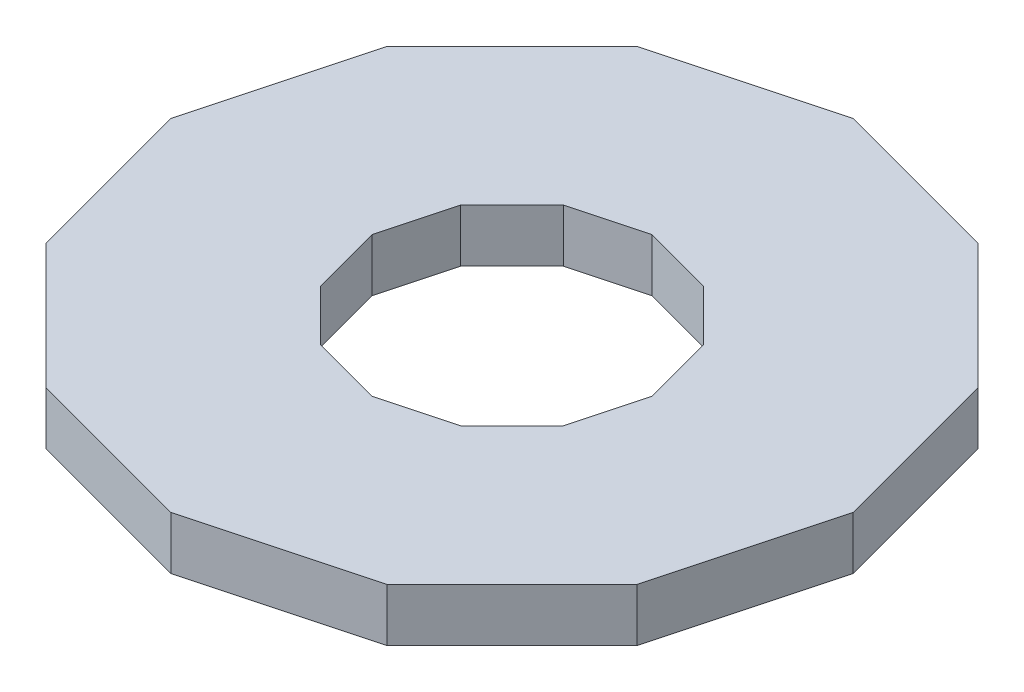
ISO-10303-21;
HEADER;
FILE_DESCRIPTION(('STEP AP214'),'2;1');
FILE_NAME('part.step','',(''),(''),'','','');
FILE_SCHEMA(('AUTOMOTIVE_DESIGN { 1 0 10303 214 1 1 1 1 }'));
ENDSEC;
DATA;
#1=APPLICATION_CONTEXT('core data for automotive mechanical design processes');
#2=APPLICATION_PROTOCOL_DEFINITION('international standard','automotive_design',2000,#1);
#3=PRODUCT_CONTEXT('',#1,'mechanical');
#4=PRODUCT('Part','Part','',(#3));
#5=PRODUCT_RELATED_PRODUCT_CATEGORY('part','',(#4));
#6=PRODUCT_DEFINITION_FORMATION('','',#4);
#7=PRODUCT_DEFINITION_CONTEXT('part definition',#1,'design');
#8=PRODUCT_DEFINITION('design','',#6,#7);
#9=PRODUCT_DEFINITION_SHAPE('','',#8);
#10=(LENGTH_UNIT() NAMED_UNIT(*) SI_UNIT(.MILLI.,.METRE.));
#11=(NAMED_UNIT(*) PLANE_ANGLE_UNIT() SI_UNIT($,.RADIAN.));
#12=(NAMED_UNIT(*) SI_UNIT($,.STERADIAN.) SOLID_ANGLE_UNIT());
#13=UNCERTAINTY_MEASURE_WITH_UNIT(LENGTH_MEASURE(1.E-05),#10,'distance_accuracy_value','');
#14=(GEOMETRIC_REPRESENTATION_CONTEXT(3) GLOBAL_UNCERTAINTY_ASSIGNED_CONTEXT((#13)) GLOBAL_UNIT_ASSIGNED_CONTEXT((#10,
#11,#12)) REPRESENTATION_CONTEXT('',''));
#15=CARTESIAN_POINT('',(0.,0.,0.));
#16=DIRECTION('',(0.,0.,1.));
#17=DIRECTION('',(1.,0.,0.));
#18=AXIS2_PLACEMENT_3D('',#15,#16,#17);
#19=CARTESIAN_POINT('',(0.,19.05,0.));
#20=DIRECTION('',(0.,1.,0.));
#21=DIRECTION('',(0.,0.,1.));
#22=AXIS2_PLACEMENT_3D('',#19,#20,#21);
#23=PLANE('',#22);
#24=DIRECTION('',(-0.258819045102521,0.,0.965925826289068));
#25=VECTOR('',#24,1.);
#26=CARTESIAN_POINT('',(-106.237570574702,19.05,-61.3362899693558));
#27=LINE('',#26,#25);
#28=CARTESIAN_POINT('',(-106.237570574702,19.05,-61.3362899693558));
#29=VERTEX_POINT('',#28);
#30=CARTESIAN_POINT('',(-122.672579938712,19.05,0.));
#31=VERTEX_POINT('',#30);
#32=EDGE_CURVE('E291',#29,#31,#27,.T.);
#33=ORIENTED_EDGE('',*,*,#32,.T.);
#34=DIRECTION('',(0.258819045102521,0.,0.965925826289068));
#35=VECTOR('',#34,1.);
#36=CARTESIAN_POINT('',(-122.672579938712,19.05,0.));
#37=LINE('',#36,#35);
#38=CARTESIAN_POINT('',(-106.237570574702,19.05,61.3362899693559));
#39=VERTEX_POINT('',#38);
#40=EDGE_CURVE('E294',#31,#39,#37,.T.);
#41=ORIENTED_EDGE('',*,*,#40,.T.);
#42=DIRECTION('',(0.707106781186548,0.,0.707106781186547));
#43=VECTOR('',#42,1.);
#44=CARTESIAN_POINT('',(-106.237570574702,19.05,61.3362899693559));
#45=LINE('',#44,#43);
#46=CARTESIAN_POINT('',(-61.3362899693559,19.05,106.237570574702));
#47=VERTEX_POINT('',#46);
#48=EDGE_CURVE('E298',#39,#47,#45,.T.);
#49=ORIENTED_EDGE('',*,*,#48,.T.);
#50=DIRECTION('',(0.965925826289068,0.,0.25881904510252));
#51=VECTOR('',#50,1.);
#52=CARTESIAN_POINT('',(-61.3362899693559,19.05,106.237570574702));
#53=LINE('',#52,#51);
#54=CARTESIAN_POINT('',(0.,19.05,122.672579938712));
#55=VERTEX_POINT('',#54);
#56=EDGE_CURVE('E300',#47,#55,#53,.T.);
#57=ORIENTED_EDGE('',*,*,#56,.T.);
#58=DIRECTION('',(0.965925826289068,0.,-0.258819045102521));
#59=VECTOR('',#58,1.);
#60=CARTESIAN_POINT('',(0.,19.05,122.672579938712));
#61=LINE('',#60,#59);
#62=CARTESIAN_POINT('',(61.3362899693559,19.05,106.237570574702));
#63=VERTEX_POINT('',#62);
#64=EDGE_CURVE('E302',#55,#63,#61,.T.);
#65=ORIENTED_EDGE('',*,*,#64,.T.);
#66=DIRECTION('',(0.707106781186547,0.,-0.707106781186548));
#67=VECTOR('',#66,1.);
#68=CARTESIAN_POINT('',(61.3362899693559,19.05,106.237570574702));
#69=LINE('',#68,#67);
#70=CARTESIAN_POINT('',(106.237570574702,19.05,61.3362899693559));
#71=VERTEX_POINT('',#70);
#72=EDGE_CURVE('E304',#63,#71,#69,.T.);
#73=ORIENTED_EDGE('',*,*,#72,.T.);
#74=DIRECTION('',(0.258819045102521,0.,-0.965925826289068));
#75=VECTOR('',#74,1.);
#76=CARTESIAN_POINT('',(106.237570574702,19.05,61.3362899693559));
#77=LINE('',#76,#75);
#78=CARTESIAN_POINT('',(122.672579938712,19.05,0.));
#79=VERTEX_POINT('',#78);
#80=EDGE_CURVE('E306',#71,#79,#77,.T.);
#81=ORIENTED_EDGE('',*,*,#80,.T.);
#82=DIRECTION('',(-0.258819045102521,0.,-0.965925826289068));
#83=VECTOR('',#82,1.);
#84=CARTESIAN_POINT('',(122.672579938712,19.05,0.));
#85=LINE('',#84,#83);
#86=CARTESIAN_POINT('',(106.237570574702,19.05,-61.3362899693559));
#87=VERTEX_POINT('',#86);
#88=EDGE_CURVE('E308',#79,#87,#85,.T.);
#89=ORIENTED_EDGE('',*,*,#88,.T.);
#90=DIRECTION('',(-0.707106781186547,0.,-0.707106781186548));
#91=VECTOR('',#90,1.);
#92=CARTESIAN_POINT('',(106.237570574702,19.05,-61.3362899693559));
#93=LINE('',#92,#91);
#94=CARTESIAN_POINT('',(61.3362899693558,19.05,-106.237570574702));
#95=VERTEX_POINT('',#94);
#96=EDGE_CURVE('E310',#87,#95,#93,.T.);
#97=ORIENTED_EDGE('',*,*,#96,.T.);
#98=DIRECTION('',(-0.965925826289068,0.,-0.25881904510252));
#99=VECTOR('',#98,1.);
#100=CARTESIAN_POINT('',(61.3362899693558,19.05,-106.237570574702));
#101=LINE('',#100,#99);
#102=CARTESIAN_POINT('',(0.,19.05,-122.672579938712));
#103=VERTEX_POINT('',#102);
#104=EDGE_CURVE('E312',#95,#103,#101,.T.);
#105=ORIENTED_EDGE('',*,*,#104,.T.);
#106=DIRECTION('',(-0.965925826289068,0.,0.258819045102521));
#107=VECTOR('',#106,1.);
#108=CARTESIAN_POINT('',(0.,19.05,-122.672579938712));
#109=LINE('',#108,#107);
#110=CARTESIAN_POINT('',(-61.3362899693558,19.05,-106.237570574702));
#111=VERTEX_POINT('',#110);
#112=EDGE_CURVE('E314',#103,#111,#109,.T.);
#113=ORIENTED_EDGE('',*,*,#112,.T.);
#114=DIRECTION('',(-0.707106781186548,0.,0.707106781186547));
#115=VECTOR('',#114,1.);
#116=CARTESIAN_POINT('',(-61.3362899693558,19.05,-106.237570574702));
#117=LINE('',#116,#115);
#118=EDGE_CURVE('E317',#111,#29,#117,.T.);
#119=ORIENTED_EDGE('',*,*,#118,.T.);
#120=EDGE_LOOP('',(#33,#41,#49,#57,#65,#73,#81,#89,#97,#105,#113,#119));
#121=FACE_BOUND('',#120,.T.);
#122=DIRECTION('',(0.258819045102521,0.,0.965925826289068));
#123=VECTOR('',#122,1.);
#124=CARTESIAN_POINT('',(-50.3585387370672,19.05,0.));
#125=LINE('',#124,#123);
#126=CARTESIAN_POINT('',(-50.3585387370672,19.05,0.));
#127=VERTEX_POINT('',#126);
#128=CARTESIAN_POINT('',(-43.6117738437629,19.05,25.1792693685336));
#129=VERTEX_POINT('',#128);
#130=EDGE_CURVE('E203',#127,#129,#125,.T.);
#131=ORIENTED_EDGE('',*,*,#130,.F.);
#132=DIRECTION('',(-0.258819045102521,0.,0.965925826289068));
#133=VECTOR('',#132,1.);
#134=CARTESIAN_POINT('',(-43.6117738437629,19.05,-25.1792693685336));
#135=LINE('',#134,#133);
#136=CARTESIAN_POINT('',(-43.6117738437629,19.05,-25.1792693685336));
#137=VERTEX_POINT('',#136);
#138=EDGE_CURVE('E195',#137,#127,#135,.T.);
#139=ORIENTED_EDGE('',*,*,#138,.F.);
#140=DIRECTION('',(-0.707106781186548,0.,0.707106781186547));
#141=VECTOR('',#140,1.);
#142=CARTESIAN_POINT('',(-25.1792693685336,19.05,-43.6117738437629));
#143=LINE('',#142,#141);
#144=CARTESIAN_POINT('',(-25.1792693685336,19.05,-43.6117738437629));
#145=VERTEX_POINT('',#144);
#146=EDGE_CURVE('E236',#145,#137,#143,.T.);
#147=ORIENTED_EDGE('',*,*,#146,.F.);
#148=DIRECTION('',(-0.965925826289068,0.,0.258819045102521));
#149=VECTOR('',#148,1.);
#150=CARTESIAN_POINT('',(0.,19.05,-50.3585387370672));
#151=LINE('',#150,#149);
#152=CARTESIAN_POINT('',(0.,19.05,-50.3585387370672));
#153=VERTEX_POINT('',#152);
#154=EDGE_CURVE('E234',#153,#145,#151,.T.);
#155=ORIENTED_EDGE('',*,*,#154,.F.);
#156=DIRECTION('',(-0.965925826289068,0.,-0.258819045102521));
#157=VECTOR('',#156,1.);
#158=CARTESIAN_POINT('',(25.1792693685336,19.05,-43.6117738437629));
#159=LINE('',#158,#157);
#160=CARTESIAN_POINT('',(25.1792693685336,19.05,-43.6117738437629));
#161=VERTEX_POINT('',#160);
#162=EDGE_CURVE('E232',#161,#153,#159,.T.);
#163=ORIENTED_EDGE('',*,*,#162,.F.);
#164=DIRECTION('',(-0.707106781186547,0.,-0.707106781186548));
#165=VECTOR('',#164,1.);
#166=CARTESIAN_POINT('',(43.6117738437629,19.05,-25.1792693685336));
#167=LINE('',#166,#165);
#168=CARTESIAN_POINT('',(43.6117738437629,19.05,-25.1792693685336));
#169=VERTEX_POINT('',#168);
#170=EDGE_CURVE('E230',#169,#161,#167,.T.);
#171=ORIENTED_EDGE('',*,*,#170,.F.);
#172=DIRECTION('',(-0.25881904510252,0.,-0.965925826289068));
#173=VECTOR('',#172,1.);
#174=CARTESIAN_POINT('',(50.3585387370672,19.05,0.));
#175=LINE('',#174,#173);
#176=CARTESIAN_POINT('',(50.3585387370672,19.05,0.));
#177=VERTEX_POINT('',#176);
#178=EDGE_CURVE('E228',#177,#169,#175,.T.);
#179=ORIENTED_EDGE('',*,*,#178,.F.);
#180=DIRECTION('',(0.258819045102521,0.,-0.965925826289068));
#181=VECTOR('',#180,1.);
#182=CARTESIAN_POINT('',(43.6117738437629,19.05,25.1792693685336));
#183=LINE('',#182,#181);
#184=CARTESIAN_POINT('',(43.6117738437629,19.05,25.1792693685336));
#185=VERTEX_POINT('',#184);
#186=EDGE_CURVE('E226',#185,#177,#183,.T.);
#187=ORIENTED_EDGE('',*,*,#186,.F.);
#188=DIRECTION('',(0.707106781186547,0.,-0.707106781186548));
#189=VECTOR('',#188,1.);
#190=CARTESIAN_POINT('',(25.1792693685336,19.05,43.6117738437629));
#191=LINE('',#190,#189);
#192=CARTESIAN_POINT('',(25.1792693685336,19.05,43.6117738437629));
#193=VERTEX_POINT('',#192);
#194=EDGE_CURVE('E224',#193,#185,#191,.T.);
#195=ORIENTED_EDGE('',*,*,#194,.F.);
#196=DIRECTION('',(0.965925826289068,0.,-0.25881904510252));
#197=VECTOR('',#196,1.);
#198=CARTESIAN_POINT('',(0.,19.05,50.3585387370672));
#199=LINE('',#198,#197);
#200=CARTESIAN_POINT('',(0.,19.05,50.3585387370672));
#201=VERTEX_POINT('',#200);
#202=EDGE_CURVE('E222',#201,#193,#199,.T.);
#203=ORIENTED_EDGE('',*,*,#202,.F.);
#204=DIRECTION('',(0.965925826289068,0.,0.258819045102521));
#205=VECTOR('',#204,1.);
#206=CARTESIAN_POINT('',(-25.1792693685336,19.05,43.6117738437629));
#207=LINE('',#206,#205);
#208=CARTESIAN_POINT('',(-25.1792693685336,19.05,43.6117738437629));
#209=VERTEX_POINT('',#208);
#210=EDGE_CURVE('E218',#209,#201,#207,.T.);
#211=ORIENTED_EDGE('',*,*,#210,.F.);
#212=DIRECTION('',(0.707106781186547,0.,0.707106781186548));
#213=VECTOR('',#212,1.);
#214=CARTESIAN_POINT('',(-43.6117738437629,19.05,25.1792693685336));
#215=LINE('',#214,#213);
#216=EDGE_CURVE('E216',#129,#209,#215,.T.);
#217=ORIENTED_EDGE('',*,*,#216,.F.);
#218=EDGE_LOOP('',(#131,#139,#147,#155,#163,#171,#179,#187,#195,#203,#211,#217));
#219=FACE_BOUND('',#218,.T.);
#220=ADVANCED_FACE('F34',(#121,#219),#23,.T.);
#221=CARTESIAN_POINT('',(0.,0.,0.));
#222=DIRECTION('',(0.,1.,0.));
#223=DIRECTION('',(0.,0.,1.));
#224=AXIS2_PLACEMENT_3D('',#221,#222,#223);
#225=PLANE('',#224);
#226=DIRECTION('',(-0.258819045102521,0.,0.965925826289068));
#227=VECTOR('',#226,1.);
#228=CARTESIAN_POINT('',(-106.237570574702,0.,-61.3362899693558));
#229=LINE('',#228,#227);
#230=CARTESIAN_POINT('',(-106.237570574702,0.,-61.3362899693558));
#231=VERTEX_POINT('',#230);
#232=CARTESIAN_POINT('',(-122.672579938712,0.,0.));
#233=VERTEX_POINT('',#232);
#234=EDGE_CURVE('E211',#231,#233,#229,.T.);
#235=ORIENTED_EDGE('',*,*,#234,.F.);
#236=DIRECTION('',(-0.707106781186548,0.,0.707106781186547));
#237=VECTOR('',#236,1.);
#238=CARTESIAN_POINT('',(-61.3362899693558,0.,-106.237570574702));
#239=LINE('',#238,#237);
#240=CARTESIAN_POINT('',(-61.3362899693558,0.,-106.237570574702));
#241=VERTEX_POINT('',#240);
#242=EDGE_CURVE('E295',#241,#231,#239,.T.);
#243=ORIENTED_EDGE('',*,*,#242,.F.);
#244=DIRECTION('',(-0.965925826289068,0.,0.258819045102521));
#245=VECTOR('',#244,1.);
#246=CARTESIAN_POINT('',(0.,0.,-122.672579938712));
#247=LINE('',#246,#245);
#248=CARTESIAN_POINT('',(0.,0.,-122.672579938712));
#249=VERTEX_POINT('',#248);
#250=EDGE_CURVE('E342',#249,#241,#247,.T.);
#251=ORIENTED_EDGE('',*,*,#250,.F.);
#252=DIRECTION('',(-0.965925826289068,0.,-0.25881904510252));
#253=VECTOR('',#252,1.);
#254=CARTESIAN_POINT('',(61.3362899693558,0.,-106.237570574702));
#255=LINE('',#254,#253);
#256=CARTESIAN_POINT('',(61.3362899693558,0.,-106.237570574702));
#257=VERTEX_POINT('',#256);
#258=EDGE_CURVE('E340',#257,#249,#255,.T.);
#259=ORIENTED_EDGE('',*,*,#258,.F.);
#260=DIRECTION('',(-0.707106781186547,0.,-0.707106781186548));
#261=VECTOR('',#260,1.);
#262=CARTESIAN_POINT('',(106.237570574702,0.,-61.3362899693559));
#263=LINE('',#262,#261);
#264=CARTESIAN_POINT('',(106.237570574702,0.,-61.3362899693559));
#265=VERTEX_POINT('',#264);
#266=EDGE_CURVE('E338',#265,#257,#263,.T.);
#267=ORIENTED_EDGE('',*,*,#266,.F.);
#268=DIRECTION('',(-0.258819045102521,0.,-0.965925826289068));
#269=VECTOR('',#268,1.);
#270=CARTESIAN_POINT('',(122.672579938712,0.,0.));
#271=LINE('',#270,#269);
#272=CARTESIAN_POINT('',(122.672579938712,0.,0.));
#273=VERTEX_POINT('',#272);
#274=EDGE_CURVE('E336',#273,#265,#271,.T.);
#275=ORIENTED_EDGE('',*,*,#274,.F.);
#276=DIRECTION('',(0.258819045102521,0.,-0.965925826289068));
#277=VECTOR('',#276,1.);
#278=CARTESIAN_POINT('',(106.237570574702,0.,61.3362899693559));
#279=LINE('',#278,#277);
#280=CARTESIAN_POINT('',(106.237570574702,0.,61.3362899693559));
#281=VERTEX_POINT('',#280);
#282=EDGE_CURVE('E334',#281,#273,#279,.T.);
#283=ORIENTED_EDGE('',*,*,#282,.F.);
#284=DIRECTION('',(0.707106781186547,0.,-0.707106781186548));
#285=VECTOR('',#284,1.);
#286=CARTESIAN_POINT('',(61.3362899693559,0.,106.237570574702));
#287=LINE('',#286,#285);
#288=CARTESIAN_POINT('',(61.3362899693559,0.,106.237570574702));
#289=VERTEX_POINT('',#288);
#290=EDGE_CURVE('E332',#289,#281,#287,.T.);
#291=ORIENTED_EDGE('',*,*,#290,.F.);
#292=DIRECTION('',(0.965925826289068,0.,-0.258819045102521));
#293=VECTOR('',#292,1.);
#294=CARTESIAN_POINT('',(0.,0.,122.672579938712));
#295=LINE('',#294,#293);
#296=CARTESIAN_POINT('',(0.,0.,122.672579938712));
#297=VERTEX_POINT('',#296);
#298=EDGE_CURVE('E330',#297,#289,#295,.T.);
#299=ORIENTED_EDGE('',*,*,#298,.F.);
#300=DIRECTION('',(0.965925826289068,0.,0.25881904510252));
#301=VECTOR('',#300,1.);
#302=CARTESIAN_POINT('',(-61.3362899693559,0.,106.237570574702));
#303=LINE('',#302,#301);
#304=CARTESIAN_POINT('',(-61.3362899693559,0.,106.237570574702));
#305=VERTEX_POINT('',#304);
#306=EDGE_CURVE('E328',#305,#297,#303,.T.);
#307=ORIENTED_EDGE('',*,*,#306,.F.);
#308=DIRECTION('',(0.707106781186548,0.,0.707106781186547));
#309=VECTOR('',#308,1.);
#310=CARTESIAN_POINT('',(-106.237570574702,0.,61.3362899693559));
#311=LINE('',#310,#309);
#312=CARTESIAN_POINT('',(-106.237570574702,0.,61.3362899693559));
#313=VERTEX_POINT('',#312);
#314=EDGE_CURVE('E326',#313,#305,#311,.T.);
#315=ORIENTED_EDGE('',*,*,#314,.F.);
#316=DIRECTION('',(0.258819045102521,0.,0.965925826289068));
#317=VECTOR('',#316,1.);
#318=CARTESIAN_POINT('',(-122.672579938712,0.,0.));
#319=LINE('',#318,#317);
#320=EDGE_CURVE('E324',#233,#313,#319,.T.);
#321=ORIENTED_EDGE('',*,*,#320,.F.);
#322=EDGE_LOOP('',(#235,#243,#251,#259,#267,#275,#283,#291,#299,#307,#315,#321));
#323=FACE_BOUND('',#322,.T.);
#324=DIRECTION('',(-0.258819045102521,0.,0.965925826289068));
#325=VECTOR('',#324,1.);
#326=CARTESIAN_POINT('',(-43.6117738437629,0.,-25.1792693685336));
#327=LINE('',#326,#325);
#328=CARTESIAN_POINT('',(-43.6117738437629,0.,-25.1792693685336));
#329=VERTEX_POINT('',#328);
#330=CARTESIAN_POINT('',(-50.3585387370672,0.,0.));
#331=VERTEX_POINT('',#330);
#332=EDGE_CURVE('E57',#329,#331,#327,.T.);
#333=ORIENTED_EDGE('',*,*,#332,.T.);
#334=DIRECTION('',(0.258819045102521,0.,0.965925826289068));
#335=VECTOR('',#334,1.);
#336=CARTESIAN_POINT('',(-50.3585387370672,0.,0.));
#337=LINE('',#336,#335);
#338=CARTESIAN_POINT('',(-43.6117738437629,0.,25.1792693685336));
#339=VERTEX_POINT('',#338);
#340=EDGE_CURVE('E210',#331,#339,#337,.T.);
#341=ORIENTED_EDGE('',*,*,#340,.T.);
#342=DIRECTION('',(0.707106781186547,0.,0.707106781186548));
#343=VECTOR('',#342,1.);
#344=CARTESIAN_POINT('',(-43.6117738437629,0.,25.1792693685336));
#345=LINE('',#344,#343);
#346=CARTESIAN_POINT('',(-25.1792693685336,0.,43.6117738437629));
#347=VERTEX_POINT('',#346);
#348=EDGE_CURVE('E240',#339,#347,#345,.T.);
#349=ORIENTED_EDGE('',*,*,#348,.T.);
#350=DIRECTION('',(0.965925826289068,0.,0.258819045102521));
#351=VECTOR('',#350,1.);
#352=CARTESIAN_POINT('',(-25.1792693685336,0.,43.6117738437629));
#353=LINE('',#352,#351);
#354=CARTESIAN_POINT('',(0.,0.,50.3585387370672));
#355=VERTEX_POINT('',#354);
#356=EDGE_CURVE('E243',#347,#355,#353,.T.);
#357=ORIENTED_EDGE('',*,*,#356,.T.);
#358=DIRECTION('',(0.965925826289068,0.,-0.25881904510252));
#359=VECTOR('',#358,1.);
#360=CARTESIAN_POINT('',(0.,0.,50.3585387370672));
#361=LINE('',#360,#359);
#362=CARTESIAN_POINT('',(25.1792693685336,0.,43.6117738437629));
#363=VERTEX_POINT('',#362);
#364=EDGE_CURVE('E246',#355,#363,#361,.T.);
#365=ORIENTED_EDGE('',*,*,#364,.T.);
#366=DIRECTION('',(0.707106781186547,0.,-0.707106781186548));
#367=VECTOR('',#366,1.);
#368=CARTESIAN_POINT('',(25.1792693685336,0.,43.6117738437629));
#369=LINE('',#368,#367);
#370=CARTESIAN_POINT('',(43.6117738437629,0.,25.1792693685336));
#371=VERTEX_POINT('',#370);
#372=EDGE_CURVE('E249',#363,#371,#369,.T.);
#373=ORIENTED_EDGE('',*,*,#372,.T.);
#374=DIRECTION('',(0.258819045102521,0.,-0.965925826289068));
#375=VECTOR('',#374,1.);
#376=CARTESIAN_POINT('',(43.6117738437629,0.,25.1792693685336));
#377=LINE('',#376,#375);
#378=CARTESIAN_POINT('',(50.3585387370672,0.,0.));
#379=VERTEX_POINT('',#378);
#380=EDGE_CURVE('E252',#371,#379,#377,.T.);
#381=ORIENTED_EDGE('',*,*,#380,.T.);
#382=DIRECTION('',(-0.25881904510252,0.,-0.965925826289068));
#383=VECTOR('',#382,1.);
#384=CARTESIAN_POINT('',(50.3585387370672,0.,0.));
#385=LINE('',#384,#383);
#386=CARTESIAN_POINT('',(43.6117738437629,0.,-25.1792693685336));
#387=VERTEX_POINT('',#386);
#388=EDGE_CURVE('E255',#379,#387,#385,.T.);
#389=ORIENTED_EDGE('',*,*,#388,.T.);
#390=DIRECTION('',(-0.707106781186547,0.,-0.707106781186548));
#391=VECTOR('',#390,1.);
#392=CARTESIAN_POINT('',(43.6117738437629,0.,-25.1792693685336));
#393=LINE('',#392,#391);
#394=CARTESIAN_POINT('',(25.1792693685336,0.,-43.6117738437629));
#395=VERTEX_POINT('',#394);
#396=EDGE_CURVE('E258',#387,#395,#393,.T.);
#397=ORIENTED_EDGE('',*,*,#396,.T.);
#398=DIRECTION('',(-0.965925826289068,0.,-0.258819045102521));
#399=VECTOR('',#398,1.);
#400=CARTESIAN_POINT('',(25.1792693685336,0.,-43.6117738437629));
#401=LINE('',#400,#399);
#402=CARTESIAN_POINT('',(0.,0.,-50.3585387370672));
#403=VERTEX_POINT('',#402);
#404=EDGE_CURVE('E261',#395,#403,#401,.T.);
#405=ORIENTED_EDGE('',*,*,#404,.T.);
#406=DIRECTION('',(-0.965925826289068,0.,0.258819045102521));
#407=VECTOR('',#406,1.);
#408=CARTESIAN_POINT('',(0.,0.,-50.3585387370672));
#409=LINE('',#408,#407);
#410=CARTESIAN_POINT('',(-25.1792693685336,0.,-43.6117738437629));
#411=VERTEX_POINT('',#410);
#412=EDGE_CURVE('E264',#403,#411,#409,.T.);
#413=ORIENTED_EDGE('',*,*,#412,.T.);
#414=DIRECTION('',(-0.707106781186548,0.,0.707106781186547));
#415=VECTOR('',#414,1.);
#416=CARTESIAN_POINT('',(-25.1792693685336,0.,-43.6117738437629));
#417=LINE('',#416,#415);
#418=EDGE_CURVE('E204',#411,#329,#417,.T.);
#419=ORIENTED_EDGE('',*,*,#418,.T.);
#420=EDGE_LOOP('',(#333,#341,#349,#357,#365,#373,#381,#389,#397,#405,#413,#419));
#421=FACE_BOUND('',#420,.T.);
#422=ADVANCED_FACE('F386',(#323,#421),#225,.F.);
#423=CARTESIAN_POINT('',(-106.237570574702,19.05,-61.3362899693558));
#424=DIRECTION('',(0.965925826289068,0.,0.258819045102521));
#425=DIRECTION('',(0.258819045102521,0.,-0.965925826289068));
#426=AXIS2_PLACEMENT_3D('',#423,#424,#425);
#427=PLANE('',#426);
#428=ORIENTED_EDGE('',*,*,#234,.T.);
#429=DIRECTION('',(0.,-1.,0.));
#430=VECTOR('',#429,1.);
#431=CARTESIAN_POINT('',(-122.672579938712,19.05,0.));
#432=LINE('',#431,#430);
#433=EDGE_CURVE('E11',#31,#233,#432,.T.);
#434=ORIENTED_EDGE('',*,*,#433,.F.);
#435=ORIENTED_EDGE('',*,*,#32,.F.);
#436=DIRECTION('',(0.,-1.,0.));
#437=VECTOR('',#436,1.);
#438=CARTESIAN_POINT('',(-106.237570574702,19.05,-61.3362899693558));
#439=LINE('',#438,#437);
#440=EDGE_CURVE('E320',#29,#231,#439,.T.);
#441=ORIENTED_EDGE('',*,*,#440,.T.);
#442=EDGE_LOOP('',(#428,#434,#435,#441));
#443=FACE_BOUND('',#442,.T.);
#444=ADVANCED_FACE('F36',(#443),#427,.F.);
#445=CARTESIAN_POINT('',(-122.672579938712,19.05,0.));
#446=DIRECTION('',(0.965925826289068,0.,-0.258819045102521));
#447=DIRECTION('',(-0.258819045102521,0.,-0.965925826289068));
#448=AXIS2_PLACEMENT_3D('',#445,#446,#447);
#449=PLANE('',#448);
#450=ORIENTED_EDGE('',*,*,#320,.T.);
#451=DIRECTION('',(0.,-1.,0.));
#452=VECTOR('',#451,1.);
#453=CARTESIAN_POINT('',(-106.237570574702,19.05,61.3362899693559));
#454=LINE('',#453,#452);
#455=EDGE_CURVE('E42',#39,#313,#454,.T.);
#456=ORIENTED_EDGE('',*,*,#455,.F.);
#457=ORIENTED_EDGE('',*,*,#40,.F.);
#458=ORIENTED_EDGE('',*,*,#433,.T.);
#459=EDGE_LOOP('',(#450,#456,#457,#458));
#460=FACE_BOUND('',#459,.T.);
#461=ADVANCED_FACE('F403',(#460),#449,.F.);
#462=CARTESIAN_POINT('',(-106.237570574702,19.05,61.3362899693559));
#463=DIRECTION('',(0.707106781186547,0.,-0.707106781186548));
#464=DIRECTION('',(-0.707106781186548,0.,-0.707106781186547));
#465=AXIS2_PLACEMENT_3D('',#462,#463,#464);
#466=PLANE('',#465);
#467=ORIENTED_EDGE('',*,*,#314,.T.);
#468=DIRECTION('',(0.,-1.,0.));
#469=VECTOR('',#468,1.);
#470=CARTESIAN_POINT('',(-61.3362899693559,19.05,106.237570574702));
#471=LINE('',#470,#469);
#472=EDGE_CURVE('E373',#47,#305,#471,.T.);
#473=ORIENTED_EDGE('',*,*,#472,.F.);
#474=ORIENTED_EDGE('',*,*,#48,.F.);
#475=ORIENTED_EDGE('',*,*,#455,.T.);
#476=EDGE_LOOP('',(#467,#473,#474,#475));
#477=FACE_BOUND('',#476,.T.);
#478=ADVANCED_FACE('F380',(#477),#466,.F.);
#479=CARTESIAN_POINT('',(-61.3362899693559,19.05,106.237570574702));
#480=DIRECTION('',(0.25881904510252,0.,-0.965925826289068));
#481=DIRECTION('',(-0.965925826289069,0.,-0.25881904510252));
#482=AXIS2_PLACEMENT_3D('',#479,#480,#481);
#483=PLANE('',#482);
#484=ORIENTED_EDGE('',*,*,#306,.T.);
#485=DIRECTION('',(0.,-1.,0.));
#486=VECTOR('',#485,1.);
#487=CARTESIAN_POINT('',(0.,19.05,122.672579938712));
#488=LINE('',#487,#486);
#489=EDGE_CURVE('E370',#55,#297,#488,.T.);
#490=ORIENTED_EDGE('',*,*,#489,.F.);
#491=ORIENTED_EDGE('',*,*,#56,.F.);
#492=ORIENTED_EDGE('',*,*,#472,.T.);
#493=EDGE_LOOP('',(#484,#490,#491,#492));
#494=FACE_BOUND('',#493,.T.);
#495=ADVANCED_FACE('F392',(#494),#483,.F.);
#496=CARTESIAN_POINT('',(0.,19.05,122.672579938712));
#497=DIRECTION('',(-0.258819045102521,0.,-0.965925826289068));
#498=DIRECTION('',(-0.965925826289068,0.,0.258819045102521));
#499=AXIS2_PLACEMENT_3D('',#496,#497,#498);
#500=PLANE('',#499);
#501=ORIENTED_EDGE('',*,*,#298,.T.);
#502=DIRECTION('',(0.,-1.,0.));
#503=VECTOR('',#502,1.);
#504=CARTESIAN_POINT('',(61.3362899693559,19.05,106.237570574702));
#505=LINE('',#504,#503);
#506=EDGE_CURVE('E367',#63,#289,#505,.T.);
#507=ORIENTED_EDGE('',*,*,#506,.F.);
#508=ORIENTED_EDGE('',*,*,#64,.F.);
#509=ORIENTED_EDGE('',*,*,#489,.T.);
#510=EDGE_LOOP('',(#501,#507,#508,#509));
#511=FACE_BOUND('',#510,.T.);
#512=ADVANCED_FACE('F396',(#511),#500,.F.);
#513=CARTESIAN_POINT('',(61.3362899693559,19.05,106.237570574702));
#514=DIRECTION('',(-0.707106781186548,0.,-0.707106781186547));
#515=DIRECTION('',(-0.707106781186547,0.,0.707106781186548));
#516=AXIS2_PLACEMENT_3D('',#513,#514,#515);
#517=PLANE('',#516);
#518=ORIENTED_EDGE('',*,*,#290,.T.);
#519=DIRECTION('',(0.,-1.,0.));
#520=VECTOR('',#519,1.);
#521=CARTESIAN_POINT('',(106.237570574702,19.05,61.3362899693559));
#522=LINE('',#521,#520);
#523=EDGE_CURVE('E364',#71,#281,#522,.T.);
#524=ORIENTED_EDGE('',*,*,#523,.F.);
#525=ORIENTED_EDGE('',*,*,#72,.F.);
#526=ORIENTED_EDGE('',*,*,#506,.T.);
#527=EDGE_LOOP('',(#518,#524,#525,#526));
#528=FACE_BOUND('',#527,.T.);
#529=ADVANCED_FACE('F436',(#528),#517,.F.);
#530=CARTESIAN_POINT('',(106.237570574702,19.05,61.3362899693559));
#531=DIRECTION('',(-0.965925826289068,0.,-0.258819045102521));
#532=DIRECTION('',(-0.258819045102521,0.,0.965925826289068));
#533=AXIS2_PLACEMENT_3D('',#530,#531,#532);
#534=PLANE('',#533);
#535=ORIENTED_EDGE('',*,*,#282,.T.);
#536=DIRECTION('',(0.,-1.,0.));
#537=VECTOR('',#536,1.);
#538=CARTESIAN_POINT('',(122.672579938712,19.05,0.));
#539=LINE('',#538,#537);
#540=EDGE_CURVE('E361',#79,#273,#539,.T.);
#541=ORIENTED_EDGE('',*,*,#540,.F.);
#542=ORIENTED_EDGE('',*,*,#80,.F.);
#543=ORIENTED_EDGE('',*,*,#523,.T.);
#544=EDGE_LOOP('',(#535,#541,#542,#543));
#545=FACE_BOUND('',#544,.T.);
#546=ADVANCED_FACE('F434',(#545),#534,.F.);
#547=CARTESIAN_POINT('',(122.672579938712,19.05,0.));
#548=DIRECTION('',(-0.965925826289068,0.,0.258819045102521));
#549=DIRECTION('',(0.258819045102521,0.,0.965925826289068));
#550=AXIS2_PLACEMENT_3D('',#547,#548,#549);
#551=PLANE('',#550);
#552=ORIENTED_EDGE('',*,*,#274,.T.);
#553=DIRECTION('',(0.,-1.,0.));
#554=VECTOR('',#553,1.);
#555=CARTESIAN_POINT('',(106.237570574702,19.05,-61.3362899693559));
#556=LINE('',#555,#554);
#557=EDGE_CURVE('E358',#87,#265,#556,.T.);
#558=ORIENTED_EDGE('',*,*,#557,.F.);
#559=ORIENTED_EDGE('',*,*,#88,.F.);
#560=ORIENTED_EDGE('',*,*,#540,.T.);
#561=EDGE_LOOP('',(#552,#558,#559,#560));
#562=FACE_BOUND('',#561,.T.);
#563=ADVANCED_FACE('F430',(#562),#551,.F.);
#564=CARTESIAN_POINT('',(106.237570574702,19.05,-61.3362899693559));
#565=DIRECTION('',(-0.707106781186548,0.,0.707106781186547));
#566=DIRECTION('',(0.707106781186547,0.,0.707106781186548));
#567=AXIS2_PLACEMENT_3D('',#564,#565,#566);
#568=PLANE('',#567);
#569=ORIENTED_EDGE('',*,*,#266,.T.);
#570=DIRECTION('',(0.,-1.,0.));
#571=VECTOR('',#570,1.);
#572=CARTESIAN_POINT('',(61.3362899693558,19.05,-106.237570574702));
#573=LINE('',#572,#571);
#574=EDGE_CURVE('E355',#95,#257,#573,.T.);
#575=ORIENTED_EDGE('',*,*,#574,.F.);
#576=ORIENTED_EDGE('',*,*,#96,.F.);
#577=ORIENTED_EDGE('',*,*,#557,.T.);
#578=EDGE_LOOP('',(#569,#575,#576,#577));
#579=FACE_BOUND('',#578,.T.);
#580=ADVANCED_FACE('F425',(#579),#568,.F.);
#581=CARTESIAN_POINT('',(61.3362899693558,19.05,-106.237570574702));
#582=DIRECTION('',(-0.25881904510252,0.,0.965925826289068));
#583=DIRECTION('',(0.965925826289069,0.,0.25881904510252));
#584=AXIS2_PLACEMENT_3D('',#581,#582,#583);
#585=PLANE('',#584);
#586=ORIENTED_EDGE('',*,*,#258,.T.);
#587=DIRECTION('',(0.,-1.,0.));
#588=VECTOR('',#587,1.);
#589=CARTESIAN_POINT('',(0.,19.05,-122.672579938712));
#590=LINE('',#589,#588);
#591=EDGE_CURVE('E352',#103,#249,#590,.T.);
#592=ORIENTED_EDGE('',*,*,#591,.F.);
#593=ORIENTED_EDGE('',*,*,#104,.F.);
#594=ORIENTED_EDGE('',*,*,#574,.T.);
#595=EDGE_LOOP('',(#586,#592,#593,#594));
#596=FACE_BOUND('',#595,.T.);
#597=ADVANCED_FACE('F419',(#596),#585,.F.);
#598=CARTESIAN_POINT('',(0.,19.05,-122.672579938712));
#599=DIRECTION('',(0.258819045102521,0.,0.965925826289068));
#600=DIRECTION('',(0.965925826289068,0.,-0.258819045102521));
#601=AXIS2_PLACEMENT_3D('',#598,#599,#600);
#602=PLANE('',#601);
#603=ORIENTED_EDGE('',*,*,#250,.T.);
#604=DIRECTION('',(0.,-1.,0.));
#605=VECTOR('',#604,1.);
#606=CARTESIAN_POINT('',(-61.3362899693558,19.05,-106.237570574702));
#607=LINE('',#606,#605);
#608=EDGE_CURVE('E348',#111,#241,#607,.T.);
#609=ORIENTED_EDGE('',*,*,#608,.F.);
#610=ORIENTED_EDGE('',*,*,#112,.F.);
#611=ORIENTED_EDGE('',*,*,#591,.T.);
#612=EDGE_LOOP('',(#603,#609,#610,#611));
#613=FACE_BOUND('',#612,.T.);
#614=ADVANCED_FACE('F415',(#613),#602,.F.);
#615=CARTESIAN_POINT('',(-61.3362899693558,19.05,-106.237570574702));
#616=DIRECTION('',(0.707106781186547,0.,0.707106781186548));
#617=DIRECTION('',(0.707106781186548,0.,-0.707106781186547));
#618=AXIS2_PLACEMENT_3D('',#615,#616,#617);
#619=PLANE('',#618);
#620=ORIENTED_EDGE('',*,*,#242,.T.);
#621=ORIENTED_EDGE('',*,*,#440,.F.);
#622=ORIENTED_EDGE('',*,*,#118,.F.);
#623=ORIENTED_EDGE('',*,*,#608,.T.);
#624=EDGE_LOOP('',(#620,#621,#622,#623));
#625=FACE_BOUND('',#624,.T.);
#626=ADVANCED_FACE('F410',(#625),#619,.F.);
#627=CARTESIAN_POINT('',(-43.6117738437629,19.05,-25.1792693685336));
#628=DIRECTION('',(0.965925826289068,0.,0.258819045102521));
#629=DIRECTION('',(0.258819045102521,0.,-0.965925826289068));
#630=AXIS2_PLACEMENT_3D('',#627,#628,#629);
#631=PLANE('',#630);
#632=ORIENTED_EDGE('',*,*,#332,.F.);
#633=DIRECTION('',(0.,-1.,0.));
#634=VECTOR('',#633,1.);
#635=CARTESIAN_POINT('',(-43.6117738437629,19.05,-25.1792693685336));
#636=LINE('',#635,#634);
#637=EDGE_CURVE('E199',#137,#329,#636,.T.);
#638=ORIENTED_EDGE('',*,*,#637,.F.);
#639=ORIENTED_EDGE('',*,*,#138,.T.);
#640=DIRECTION('',(0.,-1.,0.));
#641=VECTOR('',#640,1.);
#642=CARTESIAN_POINT('',(-50.3585387370672,19.05,0.));
#643=LINE('',#642,#641);
#644=EDGE_CURVE('E198',#127,#331,#643,.T.);
#645=ORIENTED_EDGE('',*,*,#644,.T.);
#646=EDGE_LOOP('',(#632,#638,#639,#645));
#647=FACE_BOUND('',#646,.T.);
#648=ADVANCED_FACE('F197',(#647),#631,.T.);
#649=CARTESIAN_POINT('',(-50.3585387370672,19.05,0.));
#650=DIRECTION('',(0.965925826289068,0.,-0.258819045102521));
#651=DIRECTION('',(-0.258819045102521,0.,-0.965925826289068));
#652=AXIS2_PLACEMENT_3D('',#649,#650,#651);
#653=PLANE('',#652);
#654=ORIENTED_EDGE('',*,*,#340,.F.);
#655=ORIENTED_EDGE('',*,*,#644,.F.);
#656=ORIENTED_EDGE('',*,*,#130,.T.);
#657=DIRECTION('',(0.,-1.,0.));
#658=VECTOR('',#657,1.);
#659=CARTESIAN_POINT('',(-43.6117738437629,19.05,25.1792693685336));
#660=LINE('',#659,#658);
#661=EDGE_CURVE('E212',#129,#339,#660,.T.);
#662=ORIENTED_EDGE('',*,*,#661,.T.);
#663=EDGE_LOOP('',(#654,#655,#656,#662));
#664=FACE_BOUND('',#663,.T.);
#665=ADVANCED_FACE('F207',(#664),#653,.T.);
#666=CARTESIAN_POINT('',(-43.6117738437629,19.05,25.1792693685336));
#667=DIRECTION('',(0.707106781186548,0.,-0.707106781186547));
#668=DIRECTION('',(-0.707106781186547,0.,-0.707106781186548));
#669=AXIS2_PLACEMENT_3D('',#666,#667,#668);
#670=PLANE('',#669);
#671=ORIENTED_EDGE('',*,*,#348,.F.);
#672=ORIENTED_EDGE('',*,*,#661,.F.);
#673=ORIENTED_EDGE('',*,*,#216,.T.);
#674=DIRECTION('',(0.,-1.,0.));
#675=VECTOR('',#674,1.);
#676=CARTESIAN_POINT('',(-25.1792693685336,19.05,43.6117738437629));
#677=LINE('',#676,#675);
#678=EDGE_CURVE('E286',#209,#347,#677,.T.);
#679=ORIENTED_EDGE('',*,*,#678,.T.);
#680=EDGE_LOOP('',(#671,#672,#673,#679));
#681=FACE_BOUND('',#680,.T.);
#682=ADVANCED_FACE('F494',(#681),#670,.T.);
#683=CARTESIAN_POINT('',(-25.1792693685336,19.05,43.6117738437629));
#684=DIRECTION('',(0.258819045102521,0.,-0.965925826289068));
#685=DIRECTION('',(-0.965925826289068,0.,-0.258819045102521));
#686=AXIS2_PLACEMENT_3D('',#683,#684,#685);
#687=PLANE('',#686);
#688=ORIENTED_EDGE('',*,*,#356,.F.);
#689=ORIENTED_EDGE('',*,*,#678,.F.);
#690=ORIENTED_EDGE('',*,*,#210,.T.);
#691=DIRECTION('',(0.,-1.,0.));
#692=VECTOR('',#691,1.);
#693=CARTESIAN_POINT('',(0.,19.05,50.3585387370672));
#694=LINE('',#693,#692);
#695=EDGE_CURVE('E284',#201,#355,#694,.T.);
#696=ORIENTED_EDGE('',*,*,#695,.T.);
#697=EDGE_LOOP('',(#688,#689,#690,#696));
#698=FACE_BOUND('',#697,.T.);
#699=ADVANCED_FACE('F500',(#698),#687,.T.);
#700=CARTESIAN_POINT('',(0.,19.05,50.3585387370672));
#701=DIRECTION('',(-0.25881904510252,0.,-0.965925826289068));
#702=DIRECTION('',(-0.965925826289069,0.,0.25881904510252));
#703=AXIS2_PLACEMENT_3D('',#700,#701,#702);
#704=PLANE('',#703);
#705=ORIENTED_EDGE('',*,*,#364,.F.);
#706=ORIENTED_EDGE('',*,*,#695,.F.);
#707=ORIENTED_EDGE('',*,*,#202,.T.);
#708=DIRECTION('',(0.,-1.,0.));
#709=VECTOR('',#708,1.);
#710=CARTESIAN_POINT('',(25.1792693685336,19.05,43.6117738437629));
#711=LINE('',#710,#709);
#712=EDGE_CURVE('E281',#193,#363,#711,.T.);
#713=ORIENTED_EDGE('',*,*,#712,.T.);
#714=EDGE_LOOP('',(#705,#706,#707,#713));
#715=FACE_BOUND('',#714,.T.);
#716=ADVANCED_FACE('F508',(#715),#704,.T.);
#717=CARTESIAN_POINT('',(25.1792693685336,19.05,43.6117738437629));
#718=DIRECTION('',(-0.707106781186548,0.,-0.707106781186547));
#719=DIRECTION('',(-0.707106781186547,0.,0.707106781186548));
#720=AXIS2_PLACEMENT_3D('',#717,#718,#719);
#721=PLANE('',#720);
#722=ORIENTED_EDGE('',*,*,#372,.F.);
#723=ORIENTED_EDGE('',*,*,#712,.F.);
#724=ORIENTED_EDGE('',*,*,#194,.T.);
#725=DIRECTION('',(0.,-1.,0.));
#726=VECTOR('',#725,1.);
#727=CARTESIAN_POINT('',(43.6117738437629,19.05,25.1792693685336));
#728=LINE('',#727,#726);
#729=EDGE_CURVE('E279',#185,#371,#728,.T.);
#730=ORIENTED_EDGE('',*,*,#729,.T.);
#731=EDGE_LOOP('',(#722,#723,#724,#730));
#732=FACE_BOUND('',#731,.T.);
#733=ADVANCED_FACE('F516',(#732),#721,.T.);
#734=CARTESIAN_POINT('',(43.6117738437629,19.05,25.1792693685336));
#735=DIRECTION('',(-0.965925826289068,0.,-0.258819045102521));
#736=DIRECTION('',(-0.258819045102521,0.,0.965925826289068));
#737=AXIS2_PLACEMENT_3D('',#734,#735,#736);
#738=PLANE('',#737);
#739=ORIENTED_EDGE('',*,*,#380,.F.);
#740=ORIENTED_EDGE('',*,*,#729,.F.);
#741=ORIENTED_EDGE('',*,*,#186,.T.);
#742=DIRECTION('',(0.,-1.,0.));
#743=VECTOR('',#742,1.);
#744=CARTESIAN_POINT('',(50.3585387370672,19.05,0.));
#745=LINE('',#744,#743);
#746=EDGE_CURVE('E277',#177,#379,#745,.T.);
#747=ORIENTED_EDGE('',*,*,#746,.T.);
#748=EDGE_LOOP('',(#739,#740,#741,#747));
#749=FACE_BOUND('',#748,.T.);
#750=ADVANCED_FACE('F524',(#749),#738,.T.);
#751=CARTESIAN_POINT('',(50.3585387370672,19.05,0.));
#752=DIRECTION('',(-0.965925826289068,0.,0.25881904510252));
#753=DIRECTION('',(0.258819045102521,0.,0.965925826289069));
#754=AXIS2_PLACEMENT_3D('',#751,#752,#753);
#755=PLANE('',#754);
#756=ORIENTED_EDGE('',*,*,#388,.F.);
#757=ORIENTED_EDGE('',*,*,#746,.F.);
#758=ORIENTED_EDGE('',*,*,#178,.T.);
#759=DIRECTION('',(0.,-1.,0.));
#760=VECTOR('',#759,1.);
#761=CARTESIAN_POINT('',(43.6117738437629,19.05,-25.1792693685336));
#762=LINE('',#761,#760);
#763=EDGE_CURVE('E275',#169,#387,#762,.T.);
#764=ORIENTED_EDGE('',*,*,#763,.T.);
#765=EDGE_LOOP('',(#756,#757,#758,#764));
#766=FACE_BOUND('',#765,.T.);
#767=ADVANCED_FACE('F532',(#766),#755,.T.);
#768=CARTESIAN_POINT('',(43.6117738437629,19.05,-25.1792693685336));
#769=DIRECTION('',(-0.707106781186548,0.,0.707106781186547));
#770=DIRECTION('',(0.707106781186547,0.,0.707106781186548));
#771=AXIS2_PLACEMENT_3D('',#768,#769,#770);
#772=PLANE('',#771);
#773=ORIENTED_EDGE('',*,*,#396,.F.);
#774=ORIENTED_EDGE('',*,*,#763,.F.);
#775=ORIENTED_EDGE('',*,*,#170,.T.);
#776=DIRECTION('',(0.,-1.,0.));
#777=VECTOR('',#776,1.);
#778=CARTESIAN_POINT('',(25.1792693685336,19.05,-43.6117738437629));
#779=LINE('',#778,#777);
#780=EDGE_CURVE('E273',#161,#395,#779,.T.);
#781=ORIENTED_EDGE('',*,*,#780,.T.);
#782=EDGE_LOOP('',(#773,#774,#775,#781));
#783=FACE_BOUND('',#782,.T.);
#784=ADVANCED_FACE('F540',(#783),#772,.T.);
#785=CARTESIAN_POINT('',(25.1792693685336,19.05,-43.6117738437629));
#786=DIRECTION('',(-0.258819045102521,0.,0.965925826289068));
#787=DIRECTION('',(0.965925826289068,0.,0.258819045102521));
#788=AXIS2_PLACEMENT_3D('',#785,#786,#787);
#789=PLANE('',#788);
#790=ORIENTED_EDGE('',*,*,#404,.F.);
#791=ORIENTED_EDGE('',*,*,#780,.F.);
#792=ORIENTED_EDGE('',*,*,#162,.T.);
#793=DIRECTION('',(0.,-1.,0.));
#794=VECTOR('',#793,1.);
#795=CARTESIAN_POINT('',(0.,19.05,-50.3585387370672));
#796=LINE('',#795,#794);
#797=EDGE_CURVE('E271',#153,#403,#796,.T.);
#798=ORIENTED_EDGE('',*,*,#797,.T.);
#799=EDGE_LOOP('',(#790,#791,#792,#798));
#800=FACE_BOUND('',#799,.T.);
#801=ADVANCED_FACE('F548',(#800),#789,.T.);
#802=CARTESIAN_POINT('',(0.,19.05,-50.3585387370672));
#803=DIRECTION('',(0.258819045102521,0.,0.965925826289068));
#804=DIRECTION('',(0.965925826289068,0.,-0.258819045102521));
#805=AXIS2_PLACEMENT_3D('',#802,#803,#804);
#806=PLANE('',#805);
#807=ORIENTED_EDGE('',*,*,#412,.F.);
#808=ORIENTED_EDGE('',*,*,#797,.F.);
#809=ORIENTED_EDGE('',*,*,#154,.T.);
#810=DIRECTION('',(0.,-1.,0.));
#811=VECTOR('',#810,1.);
#812=CARTESIAN_POINT('',(-25.1792693685336,19.05,-43.6117738437629));
#813=LINE('',#812,#811);
#814=EDGE_CURVE('E49',#145,#411,#813,.T.);
#815=ORIENTED_EDGE('',*,*,#814,.T.);
#816=EDGE_LOOP('',(#807,#808,#809,#815));
#817=FACE_BOUND('',#816,.T.);
#818=ADVANCED_FACE('F556',(#817),#806,.T.);
#819=CARTESIAN_POINT('',(-25.1792693685336,19.05,-43.6117738437629));
#820=DIRECTION('',(0.707106781186547,0.,0.707106781186548));
#821=DIRECTION('',(0.707106781186548,0.,-0.707106781186547));
#822=AXIS2_PLACEMENT_3D('',#819,#820,#821);
#823=PLANE('',#822);
#824=ORIENTED_EDGE('',*,*,#418,.F.);
#825=ORIENTED_EDGE('',*,*,#814,.F.);
#826=ORIENTED_EDGE('',*,*,#146,.T.);
#827=ORIENTED_EDGE('',*,*,#637,.T.);
#828=EDGE_LOOP('',(#824,#825,#826,#827));
#829=FACE_BOUND('',#828,.T.);
#830=ADVANCED_FACE('F564',(#829),#823,.T.);
#831=CLOSED_SHELL('',(#220,#422,#444,#461,#478,#495,#512,#529,#546,#563,#580,#597,#614,#626,
#648,#665,#682,#699,#716,#733,#750,#767,#784,#801,#818,#830));
#832=MANIFOLD_SOLID_BREP('B2',#831);
#833=ADVANCED_BREP_SHAPE_REPRESENTATION('',(#18,#832),#14);
#834=SHAPE_DEFINITION_REPRESENTATION(#9,#833);
ENDSEC;
END-ISO-10303-21;
